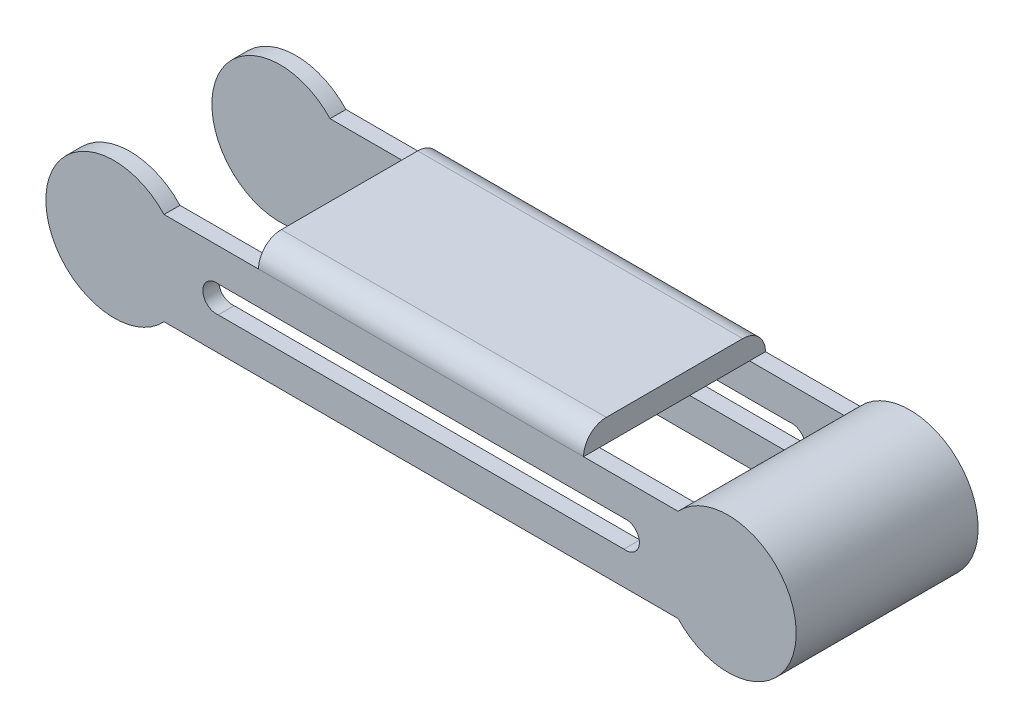
ISO-10303-21;
HEADER;
FILE_DESCRIPTION(('STEP AP214'),'2;1');
FILE_NAME('part.step','',(''),(''),'','','');
FILE_SCHEMA(('AUTOMOTIVE_DESIGN { 1 0 10303 214 1 1 1 1 }'));
ENDSEC;
DATA;
#1=APPLICATION_CONTEXT('core data for automotive mechanical design processes');
#2=APPLICATION_PROTOCOL_DEFINITION('international standard','automotive_design',2000,#1);
#3=PRODUCT_CONTEXT('',#1,'mechanical');
#4=PRODUCT('Part','Part','',(#3));
#5=PRODUCT_RELATED_PRODUCT_CATEGORY('part','',(#4));
#6=PRODUCT_DEFINITION_FORMATION('','',#4);
#7=PRODUCT_DEFINITION_CONTEXT('part definition',#1,'design');
#8=PRODUCT_DEFINITION('design','',#6,#7);
#9=PRODUCT_DEFINITION_SHAPE('','',#8);
#10=(LENGTH_UNIT() NAMED_UNIT(*) SI_UNIT(.MILLI.,.METRE.));
#11=(NAMED_UNIT(*) PLANE_ANGLE_UNIT() SI_UNIT($,.RADIAN.));
#12=(NAMED_UNIT(*) SI_UNIT($,.STERADIAN.) SOLID_ANGLE_UNIT());
#13=UNCERTAINTY_MEASURE_WITH_UNIT(LENGTH_MEASURE(1.E-05),#10,'distance_accuracy_value','');
#14=(GEOMETRIC_REPRESENTATION_CONTEXT(3) GLOBAL_UNCERTAINTY_ASSIGNED_CONTEXT((#13)) GLOBAL_UNIT_ASSIGNED_CONTEXT((#10,
#11,#12)) REPRESENTATION_CONTEXT('',''));
#15=CARTESIAN_POINT('',(0.,0.,0.));
#16=DIRECTION('',(0.,0.,1.));
#17=DIRECTION('',(1.,0.,0.));
#18=AXIS2_PLACEMENT_3D('',#15,#16,#17);
#19=CARTESIAN_POINT('',(67.5,0.,0.));
#20=DIRECTION('',(0.,0.,1.));
#21=DIRECTION('',(1.,0.,0.));
#22=AXIS2_PLACEMENT_3D('',#19,#20,#21);
#23=PLANE('',#22);
#24=DIRECTION('',(-1.,0.,0.));
#25=VECTOR('',#24,1.);
#26=CARTESIAN_POINT('',(67.5,2.95,0.));
#27=LINE('',#26,#25);
#28=CARTESIAN_POINT('',(44.6061096592177,2.95,0.));
#29=VERTEX_POINT('',#28);
#30=CARTESIAN_POINT('',(-44.6061096592177,2.95,0.));
#31=VERTEX_POINT('',#30);
#32=EDGE_CURVE('E253',#29,#31,#27,.T.);
#33=ORIENTED_EDGE('',*,*,#32,.T.);
#34=CARTESIAN_POINT('',(-45.,0.,0.));
#35=DIRECTION('',(0.,0.,1.));
#36=DIRECTION('',(1.,0.,0.));
#37=AXIS2_PLACEMENT_3D('',#34,#35,#36);
#38=CIRCLE('',#37,2.97618037097244);
#39=CARTESIAN_POINT('',(-44.6061096592177,-2.95,0.));
#40=VERTEX_POINT('',#39);
#41=EDGE_CURVE('E249',#31,#40,#38,.T.);
#42=ORIENTED_EDGE('',*,*,#41,.T.);
#43=DIRECTION('',(1.,0.,0.));
#44=VECTOR('',#43,1.);
#45=CARTESIAN_POINT('',(67.5,-2.95,0.));
#46=LINE('',#45,#44);
#47=CARTESIAN_POINT('',(44.6061096592177,-2.95,0.));
#48=VERTEX_POINT('',#47);
#49=EDGE_CURVE('E261',#40,#48,#46,.T.);
#50=ORIENTED_EDGE('',*,*,#49,.T.);
#51=CARTESIAN_POINT('',(45.0278915933969,0.,0.));
#52=DIRECTION('',(0.,0.,1.));
#53=DIRECTION('',(1.,0.,0.));
#54=AXIS2_PLACEMENT_3D('',#51,#52,#53);
#55=CIRCLE('',#54,2.98);
#56=EDGE_CURVE('E257',#48,#29,#55,.T.);
#57=ORIENTED_EDGE('',*,*,#56,.T.);
#58=EDGE_LOOP('',(#33,#42,#50,#57));
#59=FACE_BOUND('',#58,.T.);
#60=DIRECTION('',(-1.,0.,0.));
#61=VECTOR('',#60,1.);
#62=CARTESIAN_POINT('',(67.5,10.2119473962557,0.));
#63=LINE('',#62,#61);
#64=CARTESIAN_POINT('',(35.7371346445401,10.2119473962557,0.));
#65=VERTEX_POINT('',#64);
#66=CARTESIAN_POINT('',(-35.7371346445401,10.2119473962557,0.));
#67=VERTEX_POINT('',#66);
#68=EDGE_CURVE('E193',#65,#67,#63,.T.);
#69=ORIENTED_EDGE('',*,*,#68,.F.);
#70=DIRECTION('',(-1.,0.,0.));
#71=VECTOR('',#70,1.);
#72=CARTESIAN_POINT('',(-56.5129107414154,10.2119473962557,0.));
#73=LINE('',#72,#71);
#74=CARTESIAN_POINT('',(56.5129107414154,10.2119473962557,0.));
#75=VERTEX_POINT('',#74);
#76=EDGE_CURVE('E196',#75,#65,#73,.T.);
#77=ORIENTED_EDGE('',*,*,#76,.F.);
#78=CARTESIAN_POINT('',(67.5,0.,0.));
#79=DIRECTION('',(0.,0.,1.));
#80=DIRECTION('',(1.,0.,0.));
#81=AXIS2_PLACEMENT_3D('',#78,#79,#80);
#82=CIRCLE('',#81,15.);
#83=CARTESIAN_POINT('',(56.5129107414154,-10.2119473962557,0.));
#84=VERTEX_POINT('',#83);
#85=EDGE_CURVE('E293',#84,#75,#82,.T.);
#86=ORIENTED_EDGE('',*,*,#85,.F.);
#87=DIRECTION('',(1.,0.,0.));
#88=VECTOR('',#87,1.);
#89=CARTESIAN_POINT('',(-56.5129107414154,-10.2119473962557,0.));
#90=LINE('',#89,#88);
#91=CARTESIAN_POINT('',(-56.5129107414154,-10.2119473962557,0.));
#92=VERTEX_POINT('',#91);
#93=EDGE_CURVE('E285',#92,#84,#90,.T.);
#94=ORIENTED_EDGE('',*,*,#93,.F.);
#95=CARTESIAN_POINT('',(-67.5,0.,0.));
#96=DIRECTION('',(0.,0.,1.));
#97=DIRECTION('',(1.,0.,0.));
#98=AXIS2_PLACEMENT_3D('',#95,#96,#97);
#99=CIRCLE('',#98,15.);
#100=CARTESIAN_POINT('',(-56.5129107414154,10.2119473962557,0.));
#101=VERTEX_POINT('',#100);
#102=EDGE_CURVE('E220',#101,#92,#99,.T.);
#103=ORIENTED_EDGE('',*,*,#102,.F.);
#104=EDGE_CURVE('E199',#67,#101,#73,.T.);
#105=ORIENTED_EDGE('',*,*,#104,.F.);
#106=EDGE_LOOP('',(#69,#77,#86,#94,#103,#105));
#107=FACE_BOUND('',#106,.T.);
#108=ADVANCED_FACE('F43',(#59,#107),#23,.F.);
#109=CARTESIAN_POINT('',(67.5,0.,40.));
#110=DIRECTION('',(0.,0.,1.));
#111=DIRECTION('',(1.,0.,0.));
#112=AXIS2_PLACEMENT_3D('',#109,#110,#111);
#113=PLANE('',#112);
#114=CARTESIAN_POINT('',(-45.,0.,40.));
#115=DIRECTION('',(0.,0.,1.));
#116=DIRECTION('',(1.,0.,0.));
#117=AXIS2_PLACEMENT_3D('',#114,#115,#116);
#118=CIRCLE('',#117,2.97618037097244);
#119=CARTESIAN_POINT('',(-44.6061096592177,2.95,40.));
#120=VERTEX_POINT('',#119);
#121=CARTESIAN_POINT('',(-44.6061096592177,-2.95,40.));
#122=VERTEX_POINT('',#121);
#123=EDGE_CURVE('E296',#120,#122,#118,.T.);
#124=ORIENTED_EDGE('',*,*,#123,.F.);
#125=DIRECTION('',(-1.,0.,0.));
#126=VECTOR('',#125,1.);
#127=CARTESIAN_POINT('',(67.5,2.95,40.));
#128=LINE('',#127,#126);
#129=CARTESIAN_POINT('',(44.6061096592177,2.95,40.));
#130=VERTEX_POINT('',#129);
#131=EDGE_CURVE('E314',#130,#120,#128,.T.);
#132=ORIENTED_EDGE('',*,*,#131,.F.);
#133=CARTESIAN_POINT('',(45.0278915933969,0.,40.));
#134=DIRECTION('',(0.,0.,1.));
#135=DIRECTION('',(1.,0.,0.));
#136=AXIS2_PLACEMENT_3D('',#133,#134,#135);
#137=CIRCLE('',#136,2.98);
#138=CARTESIAN_POINT('',(44.6061096592177,-2.95,40.));
#139=VERTEX_POINT('',#138);
#140=EDGE_CURVE('E318',#139,#130,#137,.T.);
#141=ORIENTED_EDGE('',*,*,#140,.F.);
#142=DIRECTION('',(1.,0.,0.));
#143=VECTOR('',#142,1.);
#144=CARTESIAN_POINT('',(67.5,-2.95,40.));
#145=LINE('',#144,#143);
#146=EDGE_CURVE('E322',#122,#139,#145,.T.);
#147=ORIENTED_EDGE('',*,*,#146,.F.);
#148=EDGE_LOOP('',(#124,#132,#141,#147));
#149=FACE_BOUND('',#148,.T.);
#150=DIRECTION('',(-1.,0.,0.));
#151=VECTOR('',#150,1.);
#152=CARTESIAN_POINT('',(-56.5129107414154,10.2119473962557,40.));
#153=LINE('',#152,#151);
#154=CARTESIAN_POINT('',(56.5129107414154,10.2119473962557,40.));
#155=VERTEX_POINT('',#154);
#156=CARTESIAN_POINT('',(35.7371346445401,10.2119473962557,40.));
#157=VERTEX_POINT('',#156);
#158=EDGE_CURVE('E303',#155,#157,#153,.T.);
#159=ORIENTED_EDGE('',*,*,#158,.T.);
#160=DIRECTION('',(-1.,0.,0.));
#161=VECTOR('',#160,1.);
#162=CARTESIAN_POINT('',(67.5,10.2119473962557,40.));
#163=LINE('',#162,#161);
#164=CARTESIAN_POINT('',(-35.7371346445401,10.2119473962557,40.));
#165=VERTEX_POINT('',#164);
#166=EDGE_CURVE('E202',#157,#165,#163,.T.);
#167=ORIENTED_EDGE('',*,*,#166,.T.);
#168=CARTESIAN_POINT('',(-56.5129107414154,10.2119473962557,40.));
#169=VERTEX_POINT('',#168);
#170=EDGE_CURVE('E307',#165,#169,#153,.T.);
#171=ORIENTED_EDGE('',*,*,#170,.T.);
#172=CARTESIAN_POINT('',(-67.5,0.,40.));
#173=DIRECTION('',(0.,0.,1.));
#174=DIRECTION('',(1.,0.,0.));
#175=AXIS2_PLACEMENT_3D('',#172,#173,#174);
#176=CIRCLE('',#175,15.);
#177=CARTESIAN_POINT('',(-56.5129107414154,-10.2119473962557,40.));
#178=VERTEX_POINT('',#177);
#179=EDGE_CURVE('E300',#169,#178,#176,.T.);
#180=ORIENTED_EDGE('',*,*,#179,.T.);
#181=DIRECTION('',(1.,0.,0.));
#182=VECTOR('',#181,1.);
#183=CARTESIAN_POINT('',(-56.5129107414154,-10.2119473962557,40.));
#184=LINE('',#183,#182);
#185=CARTESIAN_POINT('',(56.5129107414154,-10.2119473962557,40.));
#186=VERTEX_POINT('',#185);
#187=EDGE_CURVE('E297',#178,#186,#184,.T.);
#188=ORIENTED_EDGE('',*,*,#187,.T.);
#189=CARTESIAN_POINT('',(67.5,0.,40.));
#190=DIRECTION('',(0.,0.,1.));
#191=DIRECTION('',(1.,0.,0.));
#192=AXIS2_PLACEMENT_3D('',#189,#190,#191);
#193=CIRCLE('',#192,15.);
#194=EDGE_CURVE('E289',#186,#155,#193,.T.);
#195=ORIENTED_EDGE('',*,*,#194,.T.);
#196=EDGE_LOOP('',(#159,#167,#171,#180,#188,#195));
#197=FACE_BOUND('',#196,.T.);
#198=ADVANCED_FACE('F430',(#149,#197),#113,.T.);
#199=CARTESIAN_POINT('',(-56.5129107414154,10.2119473962557,40.));
#200=DIRECTION('',(0.,-1.,0.));
#201=DIRECTION('',(1.,0.,0.));
#202=AXIS2_PLACEMENT_3D('',#199,#200,#201);
#203=PLANE('',#202);
#204=DIRECTION('',(0.,0.,-1.));
#205=VECTOR('',#204,1.);
#206=CARTESIAN_POINT('',(35.7371346445401,10.2119473962557,0.));
#207=LINE('',#206,#205);
#208=CARTESIAN_POINT('',(35.7371346445401,10.2119473962557,36.5));
#209=VERTEX_POINT('',#208);
#210=EDGE_CURVE('E215',#157,#209,#207,.T.);
#211=ORIENTED_EDGE('',*,*,#210,.F.);
#212=ORIENTED_EDGE('',*,*,#158,.F.);
#213=DIRECTION('',(0.,0.,-1.));
#214=VECTOR('',#213,1.);
#215=CARTESIAN_POINT('',(56.5129107414154,10.2119473962557,40.));
#216=LINE('',#215,#214);
#217=CARTESIAN_POINT('',(56.5129107414154,10.2119473962557,36.5));
#218=VERTEX_POINT('',#217);
#219=EDGE_CURVE('E265',#155,#218,#216,.T.);
#220=ORIENTED_EDGE('',*,*,#219,.T.);
#221=DIRECTION('',(1.,0.,0.));
#222=VECTOR('',#221,1.);
#223=CARTESIAN_POINT('',(-56.5129107414154,10.2119473962557,36.5));
#224=LINE('',#223,#222);
#225=EDGE_CURVE('E389',#209,#218,#224,.T.);
#226=ORIENTED_EDGE('',*,*,#225,.F.);
#227=EDGE_LOOP('',(#211,#212,#220,#226));
#228=FACE_BOUND('',#227,.T.);
#229=ADVANCED_FACE('F427',(#228),#203,.F.);
#230=DIRECTION('',(0.,0.,1.));
#231=VECTOR('',#230,1.);
#232=CARTESIAN_POINT('',(-35.7371346445401,10.2119473962557,0.));
#233=LINE('',#232,#231);
#234=CARTESIAN_POINT('',(-35.7371346445401,10.2119473962557,36.5));
#235=VERTEX_POINT('',#234);
#236=EDGE_CURVE('E414',#235,#165,#233,.T.);
#237=ORIENTED_EDGE('',*,*,#236,.F.);
#238=CARTESIAN_POINT('',(-56.5129107414154,10.2119473962557,36.5));
#239=VERTEX_POINT('',#238);
#240=EDGE_CURVE('E382',#239,#235,#224,.T.);
#241=ORIENTED_EDGE('',*,*,#240,.F.);
#242=DIRECTION('',(0.,0.,-1.));
#243=VECTOR('',#242,1.);
#244=CARTESIAN_POINT('',(-56.5129107414154,10.2119473962557,40.));
#245=LINE('',#244,#243);
#246=EDGE_CURVE('E269',#169,#239,#245,.T.);
#247=ORIENTED_EDGE('',*,*,#246,.F.);
#248=ORIENTED_EDGE('',*,*,#170,.F.);
#249=EDGE_LOOP('',(#237,#241,#247,#248));
#250=FACE_BOUND('',#249,.T.);
#251=ADVANCED_FACE('F446',(#250),#203,.F.);
#252=CARTESIAN_POINT('',(35.7371346445401,10.2119473962557,3.5));
#253=VERTEX_POINT('',#252);
#254=EDGE_CURVE('E206',#253,#65,#207,.T.);
#255=ORIENTED_EDGE('',*,*,#254,.F.);
#256=DIRECTION('',(-1.,0.,0.));
#257=VECTOR('',#256,1.);
#258=CARTESIAN_POINT('',(-56.5129107414154,10.2119473962557,3.5));
#259=LINE('',#258,#257);
#260=CARTESIAN_POINT('',(56.5129107414154,10.2119473962557,3.5));
#261=VERTEX_POINT('',#260);
#262=EDGE_CURVE('E390',#261,#253,#259,.T.);
#263=ORIENTED_EDGE('',*,*,#262,.F.);
#264=EDGE_CURVE('E218',#261,#75,#216,.T.);
#265=ORIENTED_EDGE('',*,*,#264,.T.);
#266=ORIENTED_EDGE('',*,*,#76,.T.);
#267=EDGE_LOOP('',(#255,#263,#265,#266));
#268=FACE_BOUND('',#267,.T.);
#269=ADVANCED_FACE('F216',(#268),#203,.F.);
#270=CARTESIAN_POINT('',(-35.7371346445401,10.2119473962557,3.5));
#271=VERTEX_POINT('',#270);
#272=EDGE_CURVE('E410',#67,#271,#233,.T.);
#273=ORIENTED_EDGE('',*,*,#272,.F.);
#274=ORIENTED_EDGE('',*,*,#104,.T.);
#275=CARTESIAN_POINT('',(-56.5129107414154,10.2119473962557,3.49999999999999));
#276=VERTEX_POINT('',#275);
#277=EDGE_CURVE('E273',#276,#101,#245,.T.);
#278=ORIENTED_EDGE('',*,*,#277,.F.);
#279=EDGE_CURVE('E394',#271,#276,#259,.T.);
#280=ORIENTED_EDGE('',*,*,#279,.F.);
#281=EDGE_LOOP('',(#273,#274,#278,#280));
#282=FACE_BOUND('',#281,.T.);
#283=ADVANCED_FACE('F468',(#282),#203,.F.);
#284=CARTESIAN_POINT('',(-67.5,0.,40.));
#285=DIRECTION('',(0.,0.,-1.));
#286=DIRECTION('',(-1.,0.,0.));
#287=AXIS2_PLACEMENT_3D('',#284,#285,#286);
#288=CYLINDRICAL_SURFACE('',#287,15.);
#289=ORIENTED_EDGE('',*,*,#246,.T.);
#290=CARTESIAN_POINT('',(-67.5,0.,36.5));
#291=DIRECTION('',(0.,0.,1.));
#292=DIRECTION('',(1.,0.,0.));
#293=AXIS2_PLACEMENT_3D('',#290,#291,#292);
#294=CIRCLE('',#293,15.);
#295=CARTESIAN_POINT('',(-56.5129107414154,-10.2119473962557,36.5));
#296=VERTEX_POINT('',#295);
#297=EDGE_CURVE('E403',#239,#296,#294,.T.);
#298=ORIENTED_EDGE('',*,*,#297,.T.);
#299=DIRECTION('',(0.,0.,-1.));
#300=VECTOR('',#299,1.);
#301=CARTESIAN_POINT('',(-56.5129107414154,-10.2119473962557,40.));
#302=LINE('',#301,#300);
#303=EDGE_CURVE('E274',#178,#296,#302,.T.);
#304=ORIENTED_EDGE('',*,*,#303,.F.);
#305=ORIENTED_EDGE('',*,*,#179,.F.);
#306=EDGE_LOOP('',(#289,#298,#304,#305));
#307=FACE_BOUND('',#306,.T.);
#308=ADVANCED_FACE('F530',(#307),#288,.T.);
#309=CARTESIAN_POINT('',(-56.5129107414154,-10.2119473962557,40.));
#310=DIRECTION('',(0.,1.,0.));
#311=DIRECTION('',(0.,0.,1.));
#312=AXIS2_PLACEMENT_3D('',#309,#310,#311);
#313=PLANE('',#312);
#314=ORIENTED_EDGE('',*,*,#303,.T.);
#315=DIRECTION('',(1.,0.,0.));
#316=VECTOR('',#315,1.);
#317=CARTESIAN_POINT('',(-56.5129107414154,-10.2119473962557,36.5));
#318=LINE('',#317,#316);
#319=CARTESIAN_POINT('',(56.5129107414154,-10.2119473962557,36.5));
#320=VERTEX_POINT('',#319);
#321=EDGE_CURVE('E346',#296,#320,#318,.T.);
#322=ORIENTED_EDGE('',*,*,#321,.T.);
#323=DIRECTION('',(0.,0.,-1.));
#324=VECTOR('',#323,1.);
#325=CARTESIAN_POINT('',(56.5129107414154,-10.2119473962557,40.));
#326=LINE('',#325,#324);
#327=EDGE_CURVE('E279',#186,#320,#326,.T.);
#328=ORIENTED_EDGE('',*,*,#327,.F.);
#329=ORIENTED_EDGE('',*,*,#187,.F.);
#330=EDGE_LOOP('',(#314,#322,#328,#329));
#331=FACE_BOUND('',#330,.T.);
#332=ADVANCED_FACE('F495',(#331),#313,.F.);
#333=CARTESIAN_POINT('',(-45.,0.,-10.));
#334=DIRECTION('',(0.,0.,1.));
#335=DIRECTION('',(1.,0.,0.));
#336=AXIS2_PLACEMENT_3D('',#333,#334,#335);
#337=CYLINDRICAL_SURFACE('',#336,2.97618037097244);
#338=DIRECTION('',(0.,0.,1.));
#339=VECTOR('',#338,1.);
#340=CARTESIAN_POINT('',(-44.6061096592177,-2.95,-10.));
#341=LINE('',#340,#339);
#342=CARTESIAN_POINT('',(-44.6061096592177,-2.95,36.5));
#343=VERTEX_POINT('',#342);
#344=EDGE_CURVE('E332',#343,#122,#341,.T.);
#345=ORIENTED_EDGE('',*,*,#344,.F.);
#346=CARTESIAN_POINT('',(-45.,0.,36.5));
#347=DIRECTION('',(0.,0.,1.));
#348=DIRECTION('',(1.,0.,0.));
#349=AXIS2_PLACEMENT_3D('',#346,#347,#348);
#350=CIRCLE('',#349,2.97618037097244);
#351=CARTESIAN_POINT('',(-44.6061096592177,2.95,36.5));
#352=VERTEX_POINT('',#351);
#353=EDGE_CURVE('E350',#343,#352,#350,.F.);
#354=ORIENTED_EDGE('',*,*,#353,.T.);
#355=DIRECTION('',(0.,0.,1.));
#356=VECTOR('',#355,1.);
#357=CARTESIAN_POINT('',(-44.6061096592177,2.95,-10.));
#358=LINE('',#357,#356);
#359=EDGE_CURVE('E342',#352,#120,#358,.T.);
#360=ORIENTED_EDGE('',*,*,#359,.T.);
#361=ORIENTED_EDGE('',*,*,#123,.T.);
#362=EDGE_LOOP('',(#345,#354,#360,#361));
#363=FACE_BOUND('',#362,.T.);
#364=ADVANCED_FACE('F566',(#363),#337,.F.);
#365=CARTESIAN_POINT('',(44.6061096592177,2.95,-10.));
#366=DIRECTION('',(0.,1.,0.));
#367=DIRECTION('',(0.,0.,1.));
#368=AXIS2_PLACEMENT_3D('',#365,#366,#367);
#369=PLANE('',#368);
#370=ORIENTED_EDGE('',*,*,#359,.F.);
#371=DIRECTION('',(1.,0.,0.));
#372=VECTOR('',#371,1.);
#373=CARTESIAN_POINT('',(44.6061096592177,2.95,36.5));
#374=LINE('',#373,#372);
#375=CARTESIAN_POINT('',(44.6061096592177,2.95,36.5));
#376=VERTEX_POINT('',#375);
#377=EDGE_CURVE('E354',#352,#376,#374,.T.);
#378=ORIENTED_EDGE('',*,*,#377,.T.);
#379=DIRECTION('',(0.,0.,1.));
#380=VECTOR('',#379,1.);
#381=CARTESIAN_POINT('',(44.6061096592177,2.95,-10.));
#382=LINE('',#381,#380);
#383=EDGE_CURVE('E337',#376,#130,#382,.T.);
#384=ORIENTED_EDGE('',*,*,#383,.T.);
#385=ORIENTED_EDGE('',*,*,#131,.T.);
#386=EDGE_LOOP('',(#370,#378,#384,#385));
#387=FACE_BOUND('',#386,.T.);
#388=ADVANCED_FACE('F557',(#387),#369,.F.);
#389=CARTESIAN_POINT('',(45.0278915933969,0.,-10.));
#390=DIRECTION('',(0.,0.,1.));
#391=DIRECTION('',(1.,0.,0.));
#392=AXIS2_PLACEMENT_3D('',#389,#390,#391);
#393=CYLINDRICAL_SURFACE('',#392,2.98);
#394=ORIENTED_EDGE('',*,*,#383,.F.);
#395=CARTESIAN_POINT('',(45.0278915933969,0.,36.5));
#396=DIRECTION('',(0.,0.,1.));
#397=DIRECTION('',(1.,0.,0.));
#398=AXIS2_PLACEMENT_3D('',#395,#396,#397);
#399=CIRCLE('',#398,2.98);
#400=CARTESIAN_POINT('',(44.6061096592177,-2.95,36.5));
#401=VERTEX_POINT('',#400);
#402=EDGE_CURVE('E358',#376,#401,#399,.F.);
#403=ORIENTED_EDGE('',*,*,#402,.T.);
#404=DIRECTION('',(0.,0.,1.));
#405=VECTOR('',#404,1.);
#406=CARTESIAN_POINT('',(44.6061096592177,-2.95,-10.));
#407=LINE('',#406,#405);
#408=EDGE_CURVE('E331',#401,#139,#407,.T.);
#409=ORIENTED_EDGE('',*,*,#408,.T.);
#410=ORIENTED_EDGE('',*,*,#140,.T.);
#411=EDGE_LOOP('',(#394,#403,#409,#410));
#412=FACE_BOUND('',#411,.T.);
#413=ADVANCED_FACE('F561',(#412),#393,.F.);
#414=CARTESIAN_POINT('',(44.6061096592177,-2.95,-10.));
#415=DIRECTION('',(0.,-1.,0.));
#416=DIRECTION('',(0.,0.,-1.));
#417=AXIS2_PLACEMENT_3D('',#414,#415,#416);
#418=PLANE('',#417);
#419=ORIENTED_EDGE('',*,*,#408,.F.);
#420=DIRECTION('',(-1.,0.,0.));
#421=VECTOR('',#420,1.);
#422=CARTESIAN_POINT('',(44.6061096592177,-2.95,36.5));
#423=LINE('',#422,#421);
#424=EDGE_CURVE('E241',#401,#343,#423,.T.);
#425=ORIENTED_EDGE('',*,*,#424,.T.);
#426=ORIENTED_EDGE('',*,*,#344,.T.);
#427=ORIENTED_EDGE('',*,*,#146,.T.);
#428=EDGE_LOOP('',(#419,#425,#426,#427));
#429=FACE_BOUND('',#428,.T.);
#430=ADVANCED_FACE('F534',(#429),#418,.F.);
#431=CARTESIAN_POINT('',(67.5,0.,40.));
#432=DIRECTION('',(0.,0.,-1.));
#433=DIRECTION('',(-1.,0.,0.));
#434=AXIS2_PLACEMENT_3D('',#431,#432,#433);
#435=CYLINDRICAL_SURFACE('',#434,15.);
#436=ORIENTED_EDGE('',*,*,#85,.T.);
#437=ORIENTED_EDGE('',*,*,#264,.F.);
#438=DIRECTION('',(0.,0.,-1.));
#439=VECTOR('',#438,1.);
#440=CARTESIAN_POINT('',(56.5129107414154,10.2119473962557,3.5));
#441=LINE('',#440,#439);
#442=EDGE_CURVE('E395',#218,#261,#441,.T.);
#443=ORIENTED_EDGE('',*,*,#442,.F.);
#444=ORIENTED_EDGE('',*,*,#219,.F.);
#445=ORIENTED_EDGE('',*,*,#194,.F.);
#446=ORIENTED_EDGE('',*,*,#327,.T.);
#447=CARTESIAN_POINT('',(56.5129107414154,-10.2119473962557,3.5));
#448=VERTEX_POINT('',#447);
#449=EDGE_CURVE('E283',#320,#448,#326,.T.);
#450=ORIENTED_EDGE('',*,*,#449,.T.);
#451=EDGE_CURVE('E284',#448,#84,#326,.T.);
#452=ORIENTED_EDGE('',*,*,#451,.T.);
#453=EDGE_LOOP('',(#436,#437,#443,#444,#445,#446,#450,#452));
#454=FACE_BOUND('',#453,.T.);
#455=ADVANCED_FACE('F477',(#454),#435,.T.);
#456=CARTESIAN_POINT('',(-56.5129107414154,-10.2119473962557,3.5));
#457=VERTEX_POINT('',#456);
#458=EDGE_CURVE('E278',#457,#92,#302,.T.);
#459=ORIENTED_EDGE('',*,*,#458,.F.);
#460=CARTESIAN_POINT('',(-67.5,0.,3.5));
#461=DIRECTION('',(0.,0.,-1.));
#462=DIRECTION('',(-1.,0.,0.));
#463=AXIS2_PLACEMENT_3D('',#460,#461,#462);
#464=CIRCLE('',#463,15.);
#465=EDGE_CURVE('E399',#457,#276,#464,.T.);
#466=ORIENTED_EDGE('',*,*,#465,.T.);
#467=ORIENTED_EDGE('',*,*,#277,.T.);
#468=ORIENTED_EDGE('',*,*,#102,.T.);
#469=EDGE_LOOP('',(#459,#466,#467,#468));
#470=FACE_BOUND('',#469,.T.);
#471=ADVANCED_FACE('F467',(#470),#288,.T.);
#472=ORIENTED_EDGE('',*,*,#451,.F.);
#473=DIRECTION('',(-1.,0.,0.));
#474=VECTOR('',#473,1.);
#475=CARTESIAN_POINT('',(-56.5129107414154,-10.2119473962557,3.5));
#476=LINE('',#475,#474);
#477=EDGE_CURVE('E362',#448,#457,#476,.T.);
#478=ORIENTED_EDGE('',*,*,#477,.T.);
#479=ORIENTED_EDGE('',*,*,#458,.T.);
#480=ORIENTED_EDGE('',*,*,#93,.T.);
#481=EDGE_LOOP('',(#472,#478,#479,#480));
#482=FACE_BOUND('',#481,.T.);
#483=ADVANCED_FACE('F480',(#482),#313,.F.);
#484=CARTESIAN_POINT('',(-44.6061096592177,2.95,3.5));
#485=VERTEX_POINT('',#484);
#486=EDGE_CURVE('E326',#31,#485,#358,.T.);
#487=ORIENTED_EDGE('',*,*,#486,.T.);
#488=CARTESIAN_POINT('',(-45.,0.,3.5));
#489=DIRECTION('',(0.,0.,-1.));
#490=DIRECTION('',(-1.,0.,0.));
#491=AXIS2_PLACEMENT_3D('',#488,#489,#490);
#492=CIRCLE('',#491,2.97618037097244);
#493=CARTESIAN_POINT('',(-44.6061096592177,-2.95,3.5));
#494=VERTEX_POINT('',#493);
#495=EDGE_CURVE('E366',#485,#494,#492,.F.);
#496=ORIENTED_EDGE('',*,*,#495,.T.);
#497=EDGE_CURVE('E327',#40,#494,#341,.T.);
#498=ORIENTED_EDGE('',*,*,#497,.F.);
#499=ORIENTED_EDGE('',*,*,#41,.F.);
#500=EDGE_LOOP('',(#487,#496,#498,#499));
#501=FACE_BOUND('',#500,.T.);
#502=ADVANCED_FACE('F527',(#501),#337,.F.);
#503=CARTESIAN_POINT('',(44.6061096592177,2.95,3.5));
#504=VERTEX_POINT('',#503);
#505=EDGE_CURVE('E338',#29,#504,#382,.T.);
#506=ORIENTED_EDGE('',*,*,#505,.T.);
#507=DIRECTION('',(-1.,0.,0.));
#508=VECTOR('',#507,1.);
#509=CARTESIAN_POINT('',(44.6061096592177,2.95,3.5));
#510=LINE('',#509,#508);
#511=EDGE_CURVE('E370',#504,#485,#510,.T.);
#512=ORIENTED_EDGE('',*,*,#511,.T.);
#513=ORIENTED_EDGE('',*,*,#486,.F.);
#514=ORIENTED_EDGE('',*,*,#32,.F.);
#515=EDGE_LOOP('',(#506,#512,#513,#514));
#516=FACE_BOUND('',#515,.T.);
#517=ADVANCED_FACE('F552',(#516),#369,.F.);
#518=CARTESIAN_POINT('',(44.6061096592177,-2.95,3.49999999999999));
#519=VERTEX_POINT('',#518);
#520=EDGE_CURVE('E333',#48,#519,#407,.T.);
#521=ORIENTED_EDGE('',*,*,#520,.T.);
#522=CARTESIAN_POINT('',(45.0278915933969,0.,3.5));
#523=DIRECTION('',(0.,0.,-1.));
#524=DIRECTION('',(-1.,0.,0.));
#525=AXIS2_PLACEMENT_3D('',#522,#523,#524);
#526=CIRCLE('',#525,2.98);
#527=EDGE_CURVE('E374',#519,#504,#526,.F.);
#528=ORIENTED_EDGE('',*,*,#527,.T.);
#529=ORIENTED_EDGE('',*,*,#505,.F.);
#530=ORIENTED_EDGE('',*,*,#56,.F.);
#531=EDGE_LOOP('',(#521,#528,#529,#530));
#532=FACE_BOUND('',#531,.T.);
#533=ADVANCED_FACE('F555',(#532),#393,.F.);
#534=ORIENTED_EDGE('',*,*,#497,.T.);
#535=DIRECTION('',(1.,0.,0.));
#536=VECTOR('',#535,1.);
#537=CARTESIAN_POINT('',(44.6061096592177,-2.95,3.5));
#538=LINE('',#537,#536);
#539=EDGE_CURVE('E245',#494,#519,#538,.T.);
#540=ORIENTED_EDGE('',*,*,#539,.T.);
#541=ORIENTED_EDGE('',*,*,#520,.F.);
#542=ORIENTED_EDGE('',*,*,#49,.F.);
#543=EDGE_LOOP('',(#534,#540,#541,#542));
#544=FACE_BOUND('',#543,.T.);
#545=ADVANCED_FACE('F551',(#544),#418,.F.);
#546=CARTESIAN_POINT('',(56.5129107414154,-14.7880526037443,3.5));
#547=DIRECTION('',(1.,0.,0.));
#548=DIRECTION('',(0.,1.,0.));
#549=AXIS2_PLACEMENT_3D('',#546,#547,#548);
#550=PLANE('',#549);
#551=DIRECTION('',(0.,1.,0.));
#552=VECTOR('',#551,1.);
#553=CARTESIAN_POINT('',(56.5129107414154,-14.7880526037443,36.5));
#554=LINE('',#553,#552);
#555=EDGE_CURVE('E378',#320,#218,#554,.T.);
#556=ORIENTED_EDGE('',*,*,#555,.T.);
#557=ORIENTED_EDGE('',*,*,#442,.T.);
#558=DIRECTION('',(0.,1.,0.));
#559=VECTOR('',#558,1.);
#560=CARTESIAN_POINT('',(56.5129107414154,-14.7880526037443,3.5));
#561=LINE('',#560,#559);
#562=EDGE_CURVE('E379',#448,#261,#561,.T.);
#563=ORIENTED_EDGE('',*,*,#562,.F.);
#564=ORIENTED_EDGE('',*,*,#449,.F.);
#565=EDGE_LOOP('',(#556,#557,#563,#564));
#566=FACE_BOUND('',#565,.T.);
#567=ADVANCED_FACE('F483',(#566),#550,.F.);
#568=CARTESIAN_POINT('',(-56.5129107414154,-14.7880526037443,36.5));
#569=DIRECTION('',(0.,0.,1.));
#570=DIRECTION('',(1.,0.,0.));
#571=AXIS2_PLACEMENT_3D('',#568,#569,#570);
#572=PLANE('',#571);
#573=ORIENTED_EDGE('',*,*,#424,.F.);
#574=ORIENTED_EDGE('',*,*,#402,.F.);
#575=ORIENTED_EDGE('',*,*,#377,.F.);
#576=ORIENTED_EDGE('',*,*,#353,.F.);
#577=EDGE_LOOP('',(#573,#574,#575,#576));
#578=FACE_BOUND('',#577,.T.);
#579=ORIENTED_EDGE('',*,*,#321,.F.);
#580=ORIENTED_EDGE('',*,*,#297,.F.);
#581=ORIENTED_EDGE('',*,*,#240,.T.);
#582=DIRECTION('',(-1.,0.,0.));
#583=VECTOR('',#582,1.);
#584=CARTESIAN_POINT('',(-56.5129107414154,10.2119473962557,36.5));
#585=LINE('',#584,#583);
#586=EDGE_CURVE('E406',#209,#235,#585,.T.);
#587=ORIENTED_EDGE('',*,*,#586,.F.);
#588=ORIENTED_EDGE('',*,*,#225,.T.);
#589=ORIENTED_EDGE('',*,*,#555,.F.);
#590=EDGE_LOOP('',(#579,#580,#581,#587,#588,#589));
#591=FACE_BOUND('',#590,.T.);
#592=ADVANCED_FACE('F499',(#578,#591),#572,.F.);
#593=CARTESIAN_POINT('',(-56.5129107414154,-14.7880526037443,3.5));
#594=DIRECTION('',(0.,0.,-1.));
#595=DIRECTION('',(-1.,0.,0.));
#596=AXIS2_PLACEMENT_3D('',#593,#594,#595);
#597=PLANE('',#596);
#598=ORIENTED_EDGE('',*,*,#511,.F.);
#599=ORIENTED_EDGE('',*,*,#527,.F.);
#600=ORIENTED_EDGE('',*,*,#539,.F.);
#601=ORIENTED_EDGE('',*,*,#495,.F.);
#602=EDGE_LOOP('',(#598,#599,#600,#601));
#603=FACE_BOUND('',#602,.T.);
#604=ORIENTED_EDGE('',*,*,#562,.T.);
#605=ORIENTED_EDGE('',*,*,#262,.T.);
#606=EDGE_CURVE('E393',#253,#271,#259,.T.);
#607=ORIENTED_EDGE('',*,*,#606,.T.);
#608=ORIENTED_EDGE('',*,*,#279,.T.);
#609=ORIENTED_EDGE('',*,*,#465,.F.);
#610=ORIENTED_EDGE('',*,*,#477,.F.);
#611=EDGE_LOOP('',(#604,#605,#607,#608,#609,#610));
#612=FACE_BOUND('',#611,.T.);
#613=ADVANCED_FACE('F460',(#603,#612),#597,.F.);
#614=CARTESIAN_POINT('',(0.,10.2119473962557,0.));
#615=DIRECTION('',(0.,1.,0.));
#616=DIRECTION('',(0.,0.,1.));
#617=AXIS2_PLACEMENT_3D('',#614,#615,#616);
#618=PLANE('',#617);
#619=EDGE_CURVE('E209',#209,#253,#207,.T.);
#620=ORIENTED_EDGE('',*,*,#619,.F.);
#621=ORIENTED_EDGE('',*,*,#586,.T.);
#622=EDGE_CURVE('E413',#271,#235,#233,.T.);
#623=ORIENTED_EDGE('',*,*,#622,.F.);
#624=ORIENTED_EDGE('',*,*,#606,.F.);
#625=EDGE_LOOP('',(#620,#621,#623,#624));
#626=FACE_BOUND('',#625,.T.);
#627=ADVANCED_FACE('F501',(#626),#618,.F.);
#628=CARTESIAN_POINT('',(35.7371346445401,15.2119473962557,0.));
#629=DIRECTION('',(-1.,0.,0.));
#630=DIRECTION('',(0.,-1.,0.));
#631=AXIS2_PLACEMENT_3D('',#628,#629,#630);
#632=PLANE('',#631);
#633=ORIENTED_EDGE('',*,*,#254,.T.);
#634=CARTESIAN_POINT('',(35.7371346445401,10.2119473962557,5.));
#635=DIRECTION('',(-1.,0.,0.));
#636=DIRECTION('',(0.,-1.,0.));
#637=AXIS2_PLACEMENT_3D('',#634,#635,#636);
#638=CIRCLE('',#637,5.);
#639=CARTESIAN_POINT('',(35.7371346445401,15.2119473962557,5.));
#640=VERTEX_POINT('',#639);
#641=EDGE_CURVE('E11',#65,#640,#638,.F.);
#642=ORIENTED_EDGE('',*,*,#641,.T.);
#643=DIRECTION('',(0.,0.,-1.));
#644=VECTOR('',#643,1.);
#645=CARTESIAN_POINT('',(35.7371346445401,15.2119473962557,0.));
#646=LINE('',#645,#644);
#647=CARTESIAN_POINT('',(35.7371346445401,15.2119473962557,35.));
#648=VERTEX_POINT('',#647);
#649=EDGE_CURVE('E412',#648,#640,#646,.T.);
#650=ORIENTED_EDGE('',*,*,#649,.F.);
#651=CARTESIAN_POINT('',(35.7371346445401,10.2119473962557,35.));
#652=DIRECTION('',(-1.,0.,0.));
#653=DIRECTION('',(0.,-1.,0.));
#654=AXIS2_PLACEMENT_3D('',#651,#652,#653);
#655=CIRCLE('',#654,5.);
#656=EDGE_CURVE('E231',#648,#157,#655,.F.);
#657=ORIENTED_EDGE('',*,*,#656,.T.);
#658=ORIENTED_EDGE('',*,*,#210,.T.);
#659=ORIENTED_EDGE('',*,*,#619,.T.);
#660=EDGE_LOOP('',(#633,#642,#650,#657,#658,#659));
#661=FACE_BOUND('',#660,.T.);
#662=ADVANCED_FACE('F207',(#661),#632,.F.);
#663=CARTESIAN_POINT('',(-35.7371346445401,15.2119473962557,0.));
#664=DIRECTION('',(1.,0.,0.));
#665=DIRECTION('',(0.,1.,0.));
#666=AXIS2_PLACEMENT_3D('',#663,#664,#665);
#667=PLANE('',#666);
#668=DIRECTION('',(0.,0.,1.));
#669=VECTOR('',#668,1.);
#670=CARTESIAN_POINT('',(-35.7371346445401,15.2119473962557,0.));
#671=LINE('',#670,#669);
#672=CARTESIAN_POINT('',(-35.7371346445401,15.2119473962557,5.));
#673=VERTEX_POINT('',#672);
#674=CARTESIAN_POINT('',(-35.7371346445401,15.2119473962557,35.));
#675=VERTEX_POINT('',#674);
#676=EDGE_CURVE('E409',#673,#675,#671,.T.);
#677=ORIENTED_EDGE('',*,*,#676,.F.);
#678=CARTESIAN_POINT('',(-35.7371346445401,10.2119473962557,5.));
#679=DIRECTION('',(1.,0.,0.));
#680=DIRECTION('',(0.,1.,0.));
#681=AXIS2_PLACEMENT_3D('',#678,#679,#680);
#682=CIRCLE('',#681,5.);
#683=EDGE_CURVE('E52',#673,#67,#682,.F.);
#684=ORIENTED_EDGE('',*,*,#683,.T.);
#685=ORIENTED_EDGE('',*,*,#272,.T.);
#686=ORIENTED_EDGE('',*,*,#622,.T.);
#687=ORIENTED_EDGE('',*,*,#236,.T.);
#688=CARTESIAN_POINT('',(-35.7371346445401,10.2119473962557,35.));
#689=DIRECTION('',(1.,0.,0.));
#690=DIRECTION('',(0.,1.,0.));
#691=AXIS2_PLACEMENT_3D('',#688,#689,#690);
#692=CIRCLE('',#691,5.);
#693=EDGE_CURVE('E226',#165,#675,#692,.F.);
#694=ORIENTED_EDGE('',*,*,#693,.T.);
#695=EDGE_LOOP('',(#677,#684,#685,#686,#687,#694));
#696=FACE_BOUND('',#695,.T.);
#697=ADVANCED_FACE('F437',(#696),#667,.F.);
#698=CARTESIAN_POINT('',(0.,15.2119473962557,0.));
#699=DIRECTION('',(0.,1.,0.));
#700=DIRECTION('',(0.,0.,1.));
#701=AXIS2_PLACEMENT_3D('',#698,#699,#700);
#702=PLANE('',#701);
#703=ORIENTED_EDGE('',*,*,#649,.T.);
#704=DIRECTION('',(-1.,0.,0.));
#705=VECTOR('',#704,1.);
#706=CARTESIAN_POINT('',(-35.7371346445401,15.2119473962557,5.));
#707=LINE('',#706,#705);
#708=EDGE_CURVE('E222',#640,#673,#707,.T.);
#709=ORIENTED_EDGE('',*,*,#708,.T.);
#710=ORIENTED_EDGE('',*,*,#676,.T.);
#711=DIRECTION('',(1.,0.,0.));
#712=VECTOR('',#711,1.);
#713=CARTESIAN_POINT('',(0.,15.2119473962557,35.));
#714=LINE('',#713,#712);
#715=EDGE_CURVE('E201',#675,#648,#714,.T.);
#716=ORIENTED_EDGE('',*,*,#715,.T.);
#717=EDGE_LOOP('',(#703,#709,#710,#716));
#718=FACE_BOUND('',#717,.T.);
#719=ADVANCED_FACE('F420',(#718),#702,.T.);
#720=CARTESIAN_POINT('',(0.,10.2119473962557,35.));
#721=DIRECTION('',(1.,0.,0.));
#722=DIRECTION('',(0.,0.,-1.));
#723=AXIS2_PLACEMENT_3D('',#720,#721,#722);
#724=CYLINDRICAL_SURFACE('',#723,5.);
#725=ORIENTED_EDGE('',*,*,#693,.F.);
#726=ORIENTED_EDGE('',*,*,#166,.F.);
#727=ORIENTED_EDGE('',*,*,#656,.F.);
#728=ORIENTED_EDGE('',*,*,#715,.F.);
#729=EDGE_LOOP('',(#725,#726,#727,#728));
#730=FACE_BOUND('',#729,.T.);
#731=ADVANCED_FACE('F435',(#730),#724,.T.);
#732=CARTESIAN_POINT('',(0.,10.2119473962557,5.));
#733=DIRECTION('',(1.,0.,0.));
#734=DIRECTION('',(0.,0.,-1.));
#735=AXIS2_PLACEMENT_3D('',#732,#733,#734);
#736=CYLINDRICAL_SURFACE('',#735,5.);
#737=ORIENTED_EDGE('',*,*,#641,.F.);
#738=ORIENTED_EDGE('',*,*,#68,.T.);
#739=ORIENTED_EDGE('',*,*,#683,.F.);
#740=ORIENTED_EDGE('',*,*,#708,.F.);
#741=EDGE_LOOP('',(#737,#738,#739,#740));
#742=FACE_BOUND('',#741,.T.);
#743=ADVANCED_FACE('F45',(#742),#736,.T.);
#744=CLOSED_SHELL('',(#108,#198,#229,#251,#269,#283,#308,#332,#364,#388,#413,#430,#455,#471,
#483,#502,#517,#533,#545,#567,#592,#613,#627,#662,#697,#719,#731,#743));
#745=MANIFOLD_SOLID_BREP('B2',#744);
#746=ADVANCED_BREP_SHAPE_REPRESENTATION('',(#18,#745),#14);
#747=SHAPE_DEFINITION_REPRESENTATION(#9,#746);
ENDSEC;
END-ISO-10303-21;
